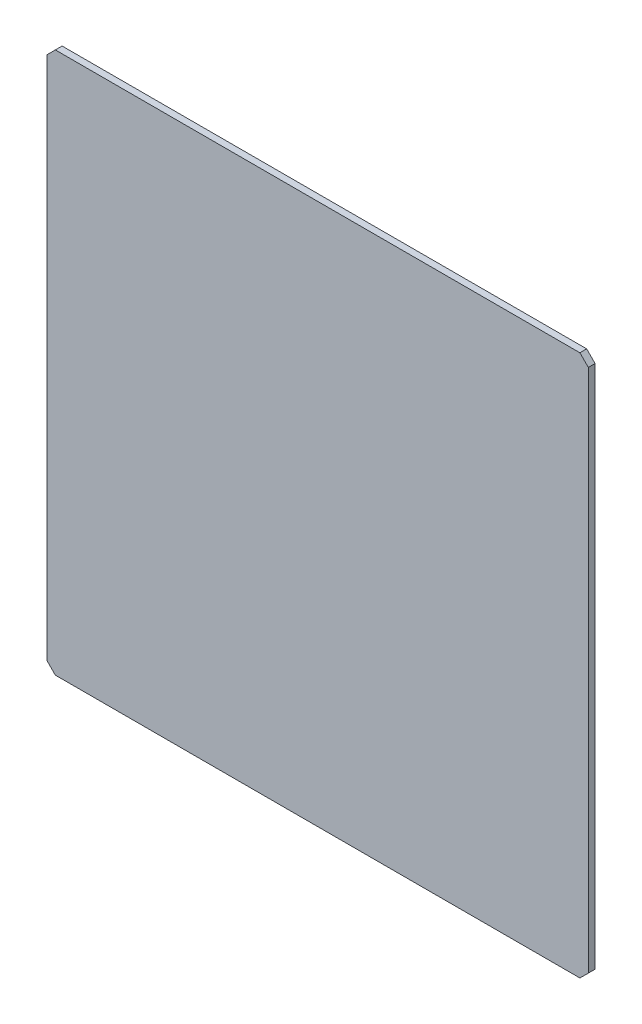
ISO-10303-21;
HEADER;
FILE_DESCRIPTION(('STEP AP214'),'2;1');
FILE_NAME('part.step','',(''),(''),'','','');
FILE_SCHEMA(('AUTOMOTIVE_DESIGN { 1 0 10303 214 1 1 1 1 }'));
ENDSEC;
DATA;
#1=APPLICATION_CONTEXT('core data for automotive mechanical design processes');
#2=APPLICATION_PROTOCOL_DEFINITION('international standard','automotive_design',2000,#1);
#3=PRODUCT_CONTEXT('',#1,'mechanical');
#4=PRODUCT('Part','Part','',(#3));
#5=PRODUCT_RELATED_PRODUCT_CATEGORY('part','',(#4));
#6=PRODUCT_DEFINITION_FORMATION('','',#4);
#7=PRODUCT_DEFINITION_CONTEXT('part definition',#1,'design');
#8=PRODUCT_DEFINITION('design','',#6,#7);
#9=PRODUCT_DEFINITION_SHAPE('','',#8);
#10=(LENGTH_UNIT() NAMED_UNIT(*) SI_UNIT(.MILLI.,.METRE.));
#11=(NAMED_UNIT(*) PLANE_ANGLE_UNIT() SI_UNIT($,.RADIAN.));
#12=(NAMED_UNIT(*) SI_UNIT($,.STERADIAN.) SOLID_ANGLE_UNIT());
#13=UNCERTAINTY_MEASURE_WITH_UNIT(LENGTH_MEASURE(1.E-05),#10,'distance_accuracy_value','');
#14=(GEOMETRIC_REPRESENTATION_CONTEXT(3) GLOBAL_UNCERTAINTY_ASSIGNED_CONTEXT((#13)) GLOBAL_UNIT_ASSIGNED_CONTEXT((#10,
#11,#12)) REPRESENTATION_CONTEXT('',''));
#15=CARTESIAN_POINT('',(0.,0.,0.));
#16=DIRECTION('',(0.,0.,1.));
#17=DIRECTION('',(1.,0.,0.));
#18=AXIS2_PLACEMENT_3D('',#15,#16,#17);
#19=CARTESIAN_POINT('',(160.,-160.,4.));
#20=DIRECTION('',(-1.,0.,0.));
#21=DIRECTION('',(0.,0.,1.));
#22=AXIS2_PLACEMENT_3D('',#19,#20,#21);
#23=PLANE('',#22);
#24=DIRECTION('',(0.,1.,0.));
#25=VECTOR('',#24,1.);
#26=CARTESIAN_POINT('',(160.,-160.,4.));
#27=LINE('',#26,#25);
#28=CARTESIAN_POINT('',(160.,-155.,4.));
#29=VERTEX_POINT('',#28);
#30=CARTESIAN_POINT('',(160.,155.,4.));
#31=VERTEX_POINT('',#30);
#32=EDGE_CURVE('E116',#29,#31,#27,.T.);
#33=ORIENTED_EDGE('',*,*,#32,.F.);
#34=DIRECTION('',(0.,0.,-1.));
#35=VECTOR('',#34,1.);
#36=CARTESIAN_POINT('',(160.,-155.,4.));
#37=LINE('',#36,#35);
#38=CARTESIAN_POINT('',(160.,-155.,0.));
#39=VERTEX_POINT('',#38);
#40=EDGE_CURVE('E101',#29,#39,#37,.T.);
#41=ORIENTED_EDGE('',*,*,#40,.T.);
#42=DIRECTION('',(0.,1.,0.));
#43=VECTOR('',#42,1.);
#44=CARTESIAN_POINT('',(160.,-160.,0.));
#45=LINE('',#44,#43);
#46=CARTESIAN_POINT('',(160.,155.,0.));
#47=VERTEX_POINT('',#46);
#48=EDGE_CURVE('E113',#39,#47,#45,.T.);
#49=ORIENTED_EDGE('',*,*,#48,.T.);
#50=DIRECTION('',(0.,0.,1.));
#51=VECTOR('',#50,1.);
#52=CARTESIAN_POINT('',(160.,155.,4.));
#53=LINE('',#52,#51);
#54=EDGE_CURVE('E118',#47,#31,#53,.T.);
#55=ORIENTED_EDGE('',*,*,#54,.T.);
#56=EDGE_LOOP('',(#33,#41,#49,#55));
#57=FACE_BOUND('',#56,.T.);
#58=ADVANCED_FACE('F32',(#57),#23,.F.);
#59=CARTESIAN_POINT('',(-160.,160.,4.));
#60=DIRECTION('',(0.,-1.,0.));
#61=DIRECTION('',(0.,0.,-1.));
#62=AXIS2_PLACEMENT_3D('',#59,#60,#61);
#63=PLANE('',#62);
#64=DIRECTION('',(-1.,0.,0.));
#65=VECTOR('',#64,1.);
#66=CARTESIAN_POINT('',(-160.,160.,4.));
#67=LINE('',#66,#65);
#68=CARTESIAN_POINT('',(155.,160.,4.));
#69=VERTEX_POINT('',#68);
#70=CARTESIAN_POINT('',(-155.,160.,4.));
#71=VERTEX_POINT('',#70);
#72=EDGE_CURVE('E167',#69,#71,#67,.T.);
#73=ORIENTED_EDGE('',*,*,#72,.F.);
#74=DIRECTION('',(0.,0.,-1.));
#75=VECTOR('',#74,1.);
#76=CARTESIAN_POINT('',(155.,160.,4.));
#77=LINE('',#76,#75);
#78=CARTESIAN_POINT('',(155.,160.,0.));
#79=VERTEX_POINT('',#78);
#80=EDGE_CURVE('E151',#69,#79,#77,.T.);
#81=ORIENTED_EDGE('',*,*,#80,.T.);
#82=DIRECTION('',(-1.,0.,0.));
#83=VECTOR('',#82,1.);
#84=CARTESIAN_POINT('',(-160.,160.,0.));
#85=LINE('',#84,#83);
#86=CARTESIAN_POINT('',(-155.,160.,0.));
#87=VERTEX_POINT('',#86);
#88=EDGE_CURVE('E122',#79,#87,#85,.T.);
#89=ORIENTED_EDGE('',*,*,#88,.T.);
#90=DIRECTION('',(0.,0.,1.));
#91=VECTOR('',#90,1.);
#92=CARTESIAN_POINT('',(-155.,160.,4.));
#93=LINE('',#92,#91);
#94=EDGE_CURVE('E149',#87,#71,#93,.T.);
#95=ORIENTED_EDGE('',*,*,#94,.T.);
#96=EDGE_LOOP('',(#73,#81,#89,#95));
#97=FACE_BOUND('',#96,.T.);
#98=ADVANCED_FACE('F177',(#97),#63,.F.);
#99=CARTESIAN_POINT('',(-160.,-160.,4.));
#100=DIRECTION('',(1.,0.,0.));
#101=DIRECTION('',(0.,0.,-1.));
#102=AXIS2_PLACEMENT_3D('',#99,#100,#101);
#103=PLANE('',#102);
#104=DIRECTION('',(0.,-1.,0.));
#105=VECTOR('',#104,1.);
#106=CARTESIAN_POINT('',(-160.,-160.,0.));
#107=LINE('',#106,#105);
#108=CARTESIAN_POINT('',(-160.,155.,0.));
#109=VERTEX_POINT('',#108);
#110=CARTESIAN_POINT('',(-160.,-155.,0.));
#111=VERTEX_POINT('',#110);
#112=EDGE_CURVE('E125',#109,#111,#107,.T.);
#113=ORIENTED_EDGE('',*,*,#112,.T.);
#114=DIRECTION('',(0.,0.,1.));
#115=VECTOR('',#114,1.);
#116=CARTESIAN_POINT('',(-160.,-155.,4.));
#117=LINE('',#116,#115);
#118=CARTESIAN_POINT('',(-160.,-155.,4.));
#119=VERTEX_POINT('',#118);
#120=EDGE_CURVE('E11',#111,#119,#117,.T.);
#121=ORIENTED_EDGE('',*,*,#120,.T.);
#122=DIRECTION('',(0.,-1.,0.));
#123=VECTOR('',#122,1.);
#124=CARTESIAN_POINT('',(-160.,-160.,4.));
#125=LINE('',#124,#123);
#126=CARTESIAN_POINT('',(-160.,155.,4.));
#127=VERTEX_POINT('',#126);
#128=EDGE_CURVE('E157',#127,#119,#125,.T.);
#129=ORIENTED_EDGE('',*,*,#128,.F.);
#130=DIRECTION('',(0.,0.,-1.));
#131=VECTOR('',#130,1.);
#132=CARTESIAN_POINT('',(-160.,155.,4.));
#133=LINE('',#132,#131);
#134=EDGE_CURVE('E40',#127,#109,#133,.T.);
#135=ORIENTED_EDGE('',*,*,#134,.T.);
#136=EDGE_LOOP('',(#113,#121,#129,#135));
#137=FACE_BOUND('',#136,.T.);
#138=ADVANCED_FACE('F156',(#137),#103,.F.);
#139=CARTESIAN_POINT('',(-160.,-160.,4.));
#140=DIRECTION('',(0.,1.,0.));
#141=DIRECTION('',(0.,0.,1.));
#142=AXIS2_PLACEMENT_3D('',#139,#140,#141);
#143=PLANE('',#142);
#144=DIRECTION('',(1.,0.,0.));
#145=VECTOR('',#144,1.);
#146=CARTESIAN_POINT('',(-160.,-160.,0.));
#147=LINE('',#146,#145);
#148=CARTESIAN_POINT('',(-155.,-160.,0.));
#149=VERTEX_POINT('',#148);
#150=CARTESIAN_POINT('',(155.,-160.,0.));
#151=VERTEX_POINT('',#150);
#152=EDGE_CURVE('E132',#149,#151,#147,.T.);
#153=ORIENTED_EDGE('',*,*,#152,.T.);
#154=DIRECTION('',(0.,0.,1.));
#155=VECTOR('',#154,1.);
#156=CARTESIAN_POINT('',(155.,-160.,4.));
#157=LINE('',#156,#155);
#158=CARTESIAN_POINT('',(155.,-160.,4.));
#159=VERTEX_POINT('',#158);
#160=EDGE_CURVE('E102',#151,#159,#157,.T.);
#161=ORIENTED_EDGE('',*,*,#160,.T.);
#162=DIRECTION('',(1.,0.,0.));
#163=VECTOR('',#162,1.);
#164=CARTESIAN_POINT('',(-160.,-160.,4.));
#165=LINE('',#164,#163);
#166=CARTESIAN_POINT('',(-155.,-160.,4.));
#167=VERTEX_POINT('',#166);
#168=EDGE_CURVE('E128',#167,#159,#165,.T.);
#169=ORIENTED_EDGE('',*,*,#168,.F.);
#170=DIRECTION('',(0.,0.,-1.));
#171=VECTOR('',#170,1.);
#172=CARTESIAN_POINT('',(-155.,-160.,4.));
#173=LINE('',#172,#171);
#174=EDGE_CURVE('E107',#167,#149,#173,.T.);
#175=ORIENTED_EDGE('',*,*,#174,.T.);
#176=EDGE_LOOP('',(#153,#161,#169,#175));
#177=FACE_BOUND('',#176,.T.);
#178=ADVANCED_FACE('F165',(#177),#143,.F.);
#179=CARTESIAN_POINT('',(0.,0.,4.));
#180=DIRECTION('',(0.,0.,-1.));
#181=DIRECTION('',(-1.,0.,0.));
#182=AXIS2_PLACEMENT_3D('',#179,#180,#181);
#183=PLANE('',#182);
#184=ORIENTED_EDGE('',*,*,#168,.T.);
#185=DIRECTION('',(-0.707106781186551,-0.707106781186544,0.));
#186=VECTOR('',#185,1.);
#187=CARTESIAN_POINT('',(160.,-155.,4.));
#188=LINE('',#187,#186);
#189=EDGE_CURVE('E147',#159,#29,#188,.F.);
#190=ORIENTED_EDGE('',*,*,#189,.T.);
#191=ORIENTED_EDGE('',*,*,#32,.T.);
#192=DIRECTION('',(0.707106781186544,-0.707106781186551,0.));
#193=VECTOR('',#192,1.);
#194=CARTESIAN_POINT('',(155.,160.,4.));
#195=LINE('',#194,#193);
#196=EDGE_CURVE('E145',#31,#69,#195,.F.);
#197=ORIENTED_EDGE('',*,*,#196,.T.);
#198=ORIENTED_EDGE('',*,*,#72,.T.);
#199=DIRECTION('',(0.707106781186551,0.707106781186544,0.));
#200=VECTOR('',#199,1.);
#201=CARTESIAN_POINT('',(-160.,155.,4.));
#202=LINE('',#201,#200);
#203=EDGE_CURVE('E52',#71,#127,#202,.F.);
#204=ORIENTED_EDGE('',*,*,#203,.T.);
#205=ORIENTED_EDGE('',*,*,#128,.T.);
#206=DIRECTION('',(-0.707106781186544,0.707106781186551,0.));
#207=VECTOR('',#206,1.);
#208=CARTESIAN_POINT('',(-155.,-160.,4.));
#209=LINE('',#208,#207);
#210=EDGE_CURVE('E143',#119,#167,#209,.F.);
#211=ORIENTED_EDGE('',*,*,#210,.T.);
#212=EDGE_LOOP('',(#184,#190,#191,#197,#198,#204,#205,#211));
#213=FACE_BOUND('',#212,.T.);
#214=ADVANCED_FACE('F171',(#213),#183,.F.);
#215=CARTESIAN_POINT('',(0.,0.,0.));
#216=DIRECTION('',(0.,0.,-1.));
#217=DIRECTION('',(-1.,0.,0.));
#218=AXIS2_PLACEMENT_3D('',#215,#216,#217);
#219=PLANE('',#218);
#220=ORIENTED_EDGE('',*,*,#48,.F.);
#221=DIRECTION('',(0.707106781186551,0.707106781186544,0.));
#222=VECTOR('',#221,1.);
#223=CARTESIAN_POINT('',(157.499999999999,-157.500000000001,0.));
#224=LINE('',#223,#222);
#225=EDGE_CURVE('E97',#39,#151,#224,.F.);
#226=ORIENTED_EDGE('',*,*,#225,.T.);
#227=ORIENTED_EDGE('',*,*,#152,.F.);
#228=DIRECTION('',(0.707106781186544,-0.707106781186551,0.));
#229=VECTOR('',#228,1.);
#230=CARTESIAN_POINT('',(-157.500000000001,-157.499999999999,0.));
#231=LINE('',#230,#229);
#232=EDGE_CURVE('E136',#149,#111,#231,.F.);
#233=ORIENTED_EDGE('',*,*,#232,.T.);
#234=ORIENTED_EDGE('',*,*,#112,.F.);
#235=DIRECTION('',(-0.707106781186551,-0.707106781186544,0.));
#236=VECTOR('',#235,1.);
#237=CARTESIAN_POINT('',(-157.499999999999,157.500000000001,0.));
#238=LINE('',#237,#236);
#239=EDGE_CURVE('E117',#109,#87,#238,.F.);
#240=ORIENTED_EDGE('',*,*,#239,.T.);
#241=ORIENTED_EDGE('',*,*,#88,.F.);
#242=DIRECTION('',(-0.707106781186544,0.707106781186551,0.));
#243=VECTOR('',#242,1.);
#244=CARTESIAN_POINT('',(157.500000000001,157.499999999999,0.));
#245=LINE('',#244,#243);
#246=EDGE_CURVE('E108',#79,#47,#245,.F.);
#247=ORIENTED_EDGE('',*,*,#246,.T.);
#248=EDGE_LOOP('',(#220,#226,#227,#233,#234,#240,#241,#247));
#249=FACE_BOUND('',#248,.T.);
#250=ADVANCED_FACE('F120',(#249),#219,.T.);
#251=CARTESIAN_POINT('',(160.,-155.,4.));
#252=DIRECTION('',(-0.707106781186544,0.707106781186551,0.));
#253=DIRECTION('',(0.,0.,-1.));
#254=AXIS2_PLACEMENT_3D('',#251,#252,#253);
#255=PLANE('',#254);
#256=ORIENTED_EDGE('',*,*,#189,.F.);
#257=ORIENTED_EDGE('',*,*,#160,.F.);
#258=ORIENTED_EDGE('',*,*,#225,.F.);
#259=ORIENTED_EDGE('',*,*,#40,.F.);
#260=EDGE_LOOP('',(#256,#257,#258,#259));
#261=FACE_BOUND('',#260,.T.);
#262=ADVANCED_FACE('F100',(#261),#255,.F.);
#263=CARTESIAN_POINT('',(155.,160.,4.));
#264=DIRECTION('',(-0.707106781186551,-0.707106781186544,0.));
#265=DIRECTION('',(0.,0.,-1.));
#266=AXIS2_PLACEMENT_3D('',#263,#264,#265);
#267=PLANE('',#266);
#268=ORIENTED_EDGE('',*,*,#196,.F.);
#269=ORIENTED_EDGE('',*,*,#54,.F.);
#270=ORIENTED_EDGE('',*,*,#246,.F.);
#271=ORIENTED_EDGE('',*,*,#80,.F.);
#272=EDGE_LOOP('',(#268,#269,#270,#271));
#273=FACE_BOUND('',#272,.T.);
#274=ADVANCED_FACE('F175',(#273),#267,.F.);
#275=CARTESIAN_POINT('',(-155.,-160.,4.));
#276=DIRECTION('',(0.707106781186551,0.707106781186544,0.));
#277=DIRECTION('',(0.,0.,-1.));
#278=AXIS2_PLACEMENT_3D('',#275,#276,#277);
#279=PLANE('',#278);
#280=ORIENTED_EDGE('',*,*,#210,.F.);
#281=ORIENTED_EDGE('',*,*,#120,.F.);
#282=ORIENTED_EDGE('',*,*,#232,.F.);
#283=ORIENTED_EDGE('',*,*,#174,.F.);
#284=EDGE_LOOP('',(#280,#281,#282,#283));
#285=FACE_BOUND('',#284,.T.);
#286=ADVANCED_FACE('F162',(#285),#279,.F.);
#287=CARTESIAN_POINT('',(-160.,155.,4.));
#288=DIRECTION('',(0.707106781186544,-0.707106781186551,0.));
#289=DIRECTION('',(0.,0.,-1.));
#290=AXIS2_PLACEMENT_3D('',#287,#288,#289);
#291=PLANE('',#290);
#292=ORIENTED_EDGE('',*,*,#203,.F.);
#293=ORIENTED_EDGE('',*,*,#94,.F.);
#294=ORIENTED_EDGE('',*,*,#239,.F.);
#295=ORIENTED_EDGE('',*,*,#134,.F.);
#296=EDGE_LOOP('',(#292,#293,#294,#295));
#297=FACE_BOUND('',#296,.T.);
#298=ADVANCED_FACE('F34',(#297),#291,.F.);
#299=CLOSED_SHELL('',(#58,#98,#138,#178,#214,#250,#262,#274,#286,#298));
#300=MANIFOLD_SOLID_BREP('B2',#299);
#301=ADVANCED_BREP_SHAPE_REPRESENTATION('',(#18,#300),#14);
#302=SHAPE_DEFINITION_REPRESENTATION(#9,#301);
ENDSEC;
END-ISO-10303-21;
